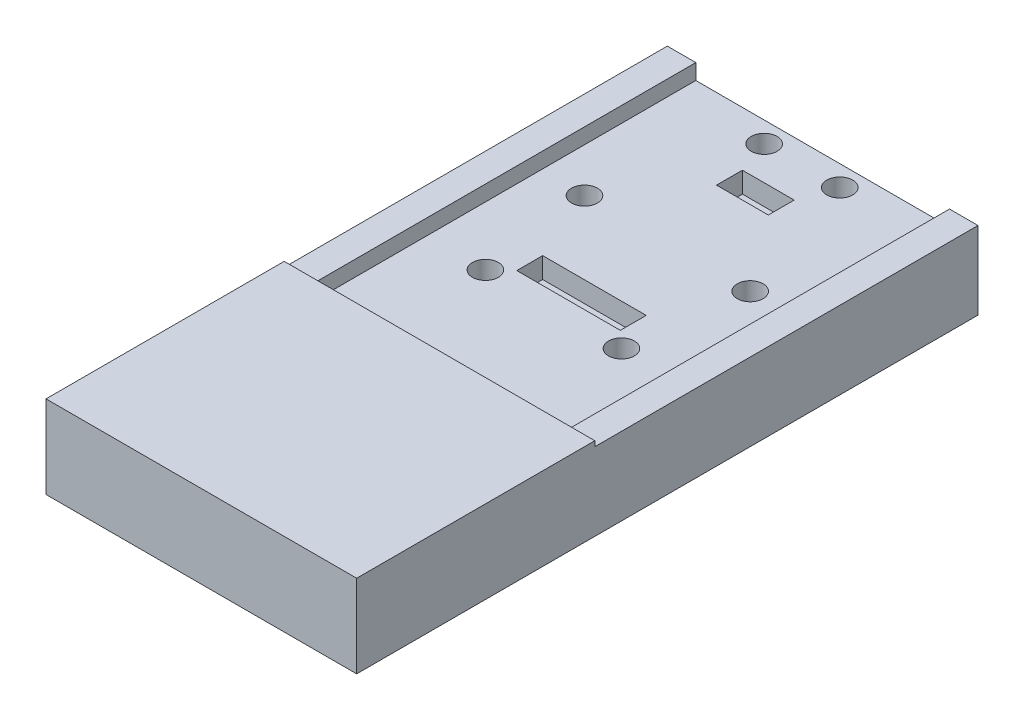
ISO-10303-21;
HEADER;
FILE_DESCRIPTION(('STEP AP214'),'2;1');
FILE_NAME('part.step','',(''),(''),'','','');
FILE_SCHEMA(('AUTOMOTIVE_DESIGN { 1 0 10303 214 1 1 1 1 }'));
ENDSEC;
DATA;
#1=APPLICATION_CONTEXT('core data for automotive mechanical design processes');
#2=APPLICATION_PROTOCOL_DEFINITION('international standard','automotive_design',2000,#1);
#3=PRODUCT_CONTEXT('',#1,'mechanical');
#4=PRODUCT('Part','Part','',(#3));
#5=PRODUCT_RELATED_PRODUCT_CATEGORY('part','',(#4));
#6=PRODUCT_DEFINITION_FORMATION('','',#4);
#7=PRODUCT_DEFINITION_CONTEXT('part definition',#1,'design');
#8=PRODUCT_DEFINITION('design','',#6,#7);
#9=PRODUCT_DEFINITION_SHAPE('','',#8);
#10=(LENGTH_UNIT() NAMED_UNIT(*) SI_UNIT(.MILLI.,.METRE.));
#11=(NAMED_UNIT(*) PLANE_ANGLE_UNIT() SI_UNIT($,.RADIAN.));
#12=(NAMED_UNIT(*) SI_UNIT($,.STERADIAN.) SOLID_ANGLE_UNIT());
#13=UNCERTAINTY_MEASURE_WITH_UNIT(LENGTH_MEASURE(1.E-05),#10,'distance_accuracy_value','');
#14=(GEOMETRIC_REPRESENTATION_CONTEXT(3) GLOBAL_UNCERTAINTY_ASSIGNED_CONTEXT((#13)) GLOBAL_UNIT_ASSIGNED_CONTEXT((#10,
#11,#12)) REPRESENTATION_CONTEXT('',''));
#15=CARTESIAN_POINT('',(0.,0.,0.));
#16=DIRECTION('',(0.,0.,1.));
#17=DIRECTION('',(1.,0.,0.));
#18=AXIS2_PLACEMENT_3D('',#15,#16,#17);
#19=CARTESIAN_POINT('',(0.,0.,0.));
#20=DIRECTION('',(0.,1.,0.));
#21=DIRECTION('',(0.,0.,1.));
#22=AXIS2_PLACEMENT_3D('',#19,#20,#21);
#23=PLANE('',#22);
#24=CARTESIAN_POINT('',(8.,0.,-15.));
#25=DIRECTION('',(0.,1.,0.));
#26=DIRECTION('',(0.,0.,1.));
#27=AXIS2_PLACEMENT_3D('',#24,#25,#26);
#28=CIRCLE('',#27,1.25);
#29=CARTESIAN_POINT('',(8.,0.,-13.75));
#30=VERTEX_POINT('',#29);
#31=EDGE_CURVE('E324',#30,#30,#28,.T.);
#32=ORIENTED_EDGE('',*,*,#31,.F.);
#33=EDGE_LOOP('',(#32));
#34=FACE_BOUND('',#33,.T.);
#35=CARTESIAN_POINT('',(-7.99999999999999,0.,-15.));
#36=DIRECTION('',(0.,1.,0.));
#37=DIRECTION('',(0.,0.,1.));
#38=AXIS2_PLACEMENT_3D('',#35,#36,#37);
#39=CIRCLE('',#38,1.25);
#40=CARTESIAN_POINT('',(-7.99999999999999,0.,-13.75));
#41=VERTEX_POINT('',#40);
#42=EDGE_CURVE('E327',#41,#41,#39,.T.);
#43=ORIENTED_EDGE('',*,*,#42,.F.);
#44=EDGE_LOOP('',(#43));
#45=FACE_BOUND('',#44,.T.);
#46=CARTESIAN_POINT('',(-3.65,0.,-28.));
#47=DIRECTION('',(0.,1.,0.));
#48=DIRECTION('',(0.,0.,1.));
#49=AXIS2_PLACEMENT_3D('',#46,#47,#48);
#50=CIRCLE('',#49,1.25);
#51=CARTESIAN_POINT('',(-3.65,0.,-26.75));
#52=VERTEX_POINT('',#51);
#53=EDGE_CURVE('E281',#52,#52,#50,.T.);
#54=ORIENTED_EDGE('',*,*,#53,.F.);
#55=EDGE_LOOP('',(#54));
#56=FACE_BOUND('',#55,.T.);
#57=CARTESIAN_POINT('',(3.65,0.,-28.));
#58=DIRECTION('',(0.,1.,0.));
#59=DIRECTION('',(0.,0.,1.));
#60=AXIS2_PLACEMENT_3D('',#57,#58,#59);
#61=CIRCLE('',#60,1.25);
#62=CARTESIAN_POINT('',(3.65,0.,-26.75));
#63=VERTEX_POINT('',#62);
#64=EDGE_CURVE('E271',#63,#63,#61,.T.);
#65=ORIENTED_EDGE('',*,*,#64,.F.);
#66=EDGE_LOOP('',(#65));
#67=FACE_BOUND('',#66,.T.);
#68=DIRECTION('',(0.,0.,1.));
#69=VECTOR('',#68,1.);
#70=CARTESIAN_POINT('',(-2.5,0.,-24.75));
#71=LINE('',#70,#69);
#72=CARTESIAN_POINT('',(-2.5,0.,-24.75));
#73=VERTEX_POINT('',#72);
#74=CARTESIAN_POINT('',(-2.5,0.,-22.25));
#75=VERTEX_POINT('',#74);
#76=EDGE_CURVE('E243',#73,#75,#71,.T.);
#77=ORIENTED_EDGE('',*,*,#76,.F.);
#78=DIRECTION('',(-1.,0.,0.));
#79=VECTOR('',#78,1.);
#80=CARTESIAN_POINT('',(-2.5,0.,-24.75));
#81=LINE('',#80,#79);
#82=CARTESIAN_POINT('',(2.5,0.,-24.75));
#83=VERTEX_POINT('',#82);
#84=EDGE_CURVE('E250',#83,#73,#81,.T.);
#85=ORIENTED_EDGE('',*,*,#84,.F.);
#86=DIRECTION('',(0.,0.,-1.));
#87=VECTOR('',#86,1.);
#88=CARTESIAN_POINT('',(2.5,0.,-24.75));
#89=LINE('',#88,#87);
#90=CARTESIAN_POINT('',(2.5,0.,-22.25));
#91=VERTEX_POINT('',#90);
#92=EDGE_CURVE('E264',#91,#83,#89,.T.);
#93=ORIENTED_EDGE('',*,*,#92,.F.);
#94=DIRECTION('',(1.,0.,0.));
#95=VECTOR('',#94,1.);
#96=CARTESIAN_POINT('',(-2.5,0.,-22.25));
#97=LINE('',#96,#95);
#98=EDGE_CURVE('E261',#75,#91,#97,.T.);
#99=ORIENTED_EDGE('',*,*,#98,.F.);
#100=EDGE_LOOP('',(#77,#85,#93,#99));
#101=FACE_BOUND('',#100,.T.);
#102=CARTESIAN_POINT('',(-6.57,0.,-4.));
#103=DIRECTION('',(0.,1.,0.));
#104=DIRECTION('',(0.,0.,1.));
#105=AXIS2_PLACEMENT_3D('',#102,#103,#104);
#106=CIRCLE('',#105,1.25);
#107=CARTESIAN_POINT('',(-6.57,0.,-2.75));
#108=VERTEX_POINT('',#107);
#109=EDGE_CURVE('E237',#108,#108,#106,.T.);
#110=ORIENTED_EDGE('',*,*,#109,.F.);
#111=EDGE_LOOP('',(#110));
#112=FACE_BOUND('',#111,.T.);
#113=CARTESIAN_POINT('',(6.57,0.,-4.));
#114=DIRECTION('',(0.,1.,0.));
#115=DIRECTION('',(0.,0.,1.));
#116=AXIS2_PLACEMENT_3D('',#113,#114,#115);
#117=CIRCLE('',#116,1.25);
#118=CARTESIAN_POINT('',(6.57,0.,-2.75));
#119=VERTEX_POINT('',#118);
#120=EDGE_CURVE('E227',#119,#119,#117,.T.);
#121=ORIENTED_EDGE('',*,*,#120,.F.);
#122=EDGE_LOOP('',(#121));
#123=FACE_BOUND('',#122,.T.);
#124=DIRECTION('',(0.,0.,1.));
#125=VECTOR('',#124,1.);
#126=CARTESIAN_POINT('',(-5.,0.,-7.95999999999999));
#127=LINE('',#126,#125);
#128=CARTESIAN_POINT('',(-5.,0.,-7.95999999999999));
#129=VERTEX_POINT('',#128);
#130=CARTESIAN_POINT('',(-5.,0.,-5.46));
#131=VERTEX_POINT('',#130);
#132=EDGE_CURVE('E201',#129,#131,#127,.T.);
#133=ORIENTED_EDGE('',*,*,#132,.F.);
#134=DIRECTION('',(-1.,0.,0.));
#135=VECTOR('',#134,1.);
#136=CARTESIAN_POINT('',(-5.,0.,-7.95999999999999));
#137=LINE('',#136,#135);
#138=CARTESIAN_POINT('',(5.,0.,-7.96));
#139=VERTEX_POINT('',#138);
#140=EDGE_CURVE('E206',#139,#129,#137,.T.);
#141=ORIENTED_EDGE('',*,*,#140,.F.);
#142=DIRECTION('',(0.,0.,-1.));
#143=VECTOR('',#142,1.);
#144=CARTESIAN_POINT('',(5.,0.,-7.96));
#145=LINE('',#144,#143);
#146=CARTESIAN_POINT('',(5.,0.,-5.46));
#147=VERTEX_POINT('',#146);
#148=EDGE_CURVE('E220',#147,#139,#145,.T.);
#149=ORIENTED_EDGE('',*,*,#148,.F.);
#150=DIRECTION('',(1.,0.,0.));
#151=VECTOR('',#150,1.);
#152=CARTESIAN_POINT('',(-5.,0.,-5.46));
#153=LINE('',#152,#151);
#154=EDGE_CURVE('E217',#131,#147,#153,.T.);
#155=ORIENTED_EDGE('',*,*,#154,.F.);
#156=EDGE_LOOP('',(#133,#141,#149,#155));
#157=FACE_BOUND('',#156,.T.);
#158=DIRECTION('',(0.,0.,-1.));
#159=VECTOR('',#158,1.);
#160=CARTESIAN_POINT('',(-12.25,0.,-30.));
#161=LINE('',#160,#159);
#162=CARTESIAN_POINT('',(-12.25,0.,7.));
#163=VERTEX_POINT('',#162);
#164=CARTESIAN_POINT('',(-12.25,0.,-30.));
#165=VERTEX_POINT('',#164);
#166=EDGE_CURVE('E37',#163,#165,#161,.T.);
#167=ORIENTED_EDGE('',*,*,#166,.F.);
#168=DIRECTION('',(-1.,0.,0.));
#169=VECTOR('',#168,1.);
#170=CARTESIAN_POINT('',(-15.,0.,7.));
#171=LINE('',#170,#169);
#172=CARTESIAN_POINT('',(12.25,0.,7.));
#173=VERTEX_POINT('',#172);
#174=EDGE_CURVE('E184',#173,#163,#171,.T.);
#175=ORIENTED_EDGE('',*,*,#174,.F.);
#176=DIRECTION('',(0.,0.,1.));
#177=VECTOR('',#176,1.);
#178=CARTESIAN_POINT('',(12.25,0.,-30.));
#179=LINE('',#178,#177);
#180=CARTESIAN_POINT('',(12.25,0.,-30.));
#181=VERTEX_POINT('',#180);
#182=EDGE_CURVE('E287',#181,#173,#179,.T.);
#183=ORIENTED_EDGE('',*,*,#182,.F.);
#184=DIRECTION('',(-1.,0.,0.));
#185=VECTOR('',#184,1.);
#186=CARTESIAN_POINT('',(-15.,0.,-30.));
#187=LINE('',#186,#185);
#188=EDGE_CURVE('E330',#181,#165,#187,.T.);
#189=ORIENTED_EDGE('',*,*,#188,.T.);
#190=EDGE_LOOP('',(#167,#175,#183,#189));
#191=FACE_BOUND('',#190,.T.);
#192=ADVANCED_FACE('F33',(#34,#45,#56,#67,#101,#112,#123,#157,#191),#23,.T.);
#193=CARTESIAN_POINT('',(-12.25,1.5,-30.));
#194=DIRECTION('',(-1.,0.,0.));
#195=DIRECTION('',(0.,0.,1.));
#196=AXIS2_PLACEMENT_3D('',#193,#194,#195);
#197=PLANE('',#196);
#198=DIRECTION('',(0.,1.,0.));
#199=VECTOR('',#198,1.);
#200=CARTESIAN_POINT('',(-12.25,1.5,7.));
#201=LINE('',#200,#199);
#202=CARTESIAN_POINT('',(-12.25,1.5,7.));
#203=VERTEX_POINT('',#202);
#204=EDGE_CURVE('E50',#163,#203,#201,.T.);
#205=ORIENTED_EDGE('',*,*,#204,.F.);
#206=ORIENTED_EDGE('',*,*,#166,.T.);
#207=DIRECTION('',(0.,-1.,0.));
#208=VECTOR('',#207,1.);
#209=CARTESIAN_POINT('',(-12.25,1.5,-30.));
#210=LINE('',#209,#208);
#211=CARTESIAN_POINT('',(-12.25,1.5,-30.));
#212=VERTEX_POINT('',#211);
#213=EDGE_CURVE('E307',#212,#165,#210,.T.);
#214=ORIENTED_EDGE('',*,*,#213,.F.);
#215=DIRECTION('',(0.,0.,-1.));
#216=VECTOR('',#215,1.);
#217=CARTESIAN_POINT('',(-12.25,1.5,-30.));
#218=LINE('',#217,#216);
#219=EDGE_CURVE('E303',#203,#212,#218,.T.);
#220=ORIENTED_EDGE('',*,*,#219,.F.);
#221=EDGE_LOOP('',(#205,#206,#214,#220));
#222=FACE_BOUND('',#221,.T.);
#223=ADVANCED_FACE('F374',(#222),#197,.F.);
#224=CARTESIAN_POINT('',(0.,1.5,0.));
#225=DIRECTION('',(0.,1.,0.));
#226=DIRECTION('',(0.,0.,1.));
#227=AXIS2_PLACEMENT_3D('',#224,#225,#226);
#228=PLANE('',#227);
#229=DIRECTION('',(0.,0.,1.));
#230=VECTOR('',#229,1.);
#231=CARTESIAN_POINT('',(-15.,1.5,-30.));
#232=LINE('',#231,#230);
#233=CARTESIAN_POINT('',(-15.,1.5,-30.));
#234=VERTEX_POINT('',#233);
#235=CARTESIAN_POINT('',(-15.,1.5,7.));
#236=VERTEX_POINT('',#235);
#237=EDGE_CURVE('E301',#234,#236,#232,.T.);
#238=ORIENTED_EDGE('',*,*,#237,.T.);
#239=DIRECTION('',(1.,0.,0.));
#240=VECTOR('',#239,1.);
#241=CARTESIAN_POINT('',(0.,1.5,7.));
#242=LINE('',#241,#240);
#243=EDGE_CURVE('E58',#236,#203,#242,.T.);
#244=ORIENTED_EDGE('',*,*,#243,.T.);
#245=ORIENTED_EDGE('',*,*,#219,.T.);
#246=DIRECTION('',(-1.,0.,0.));
#247=VECTOR('',#246,1.);
#248=CARTESIAN_POINT('',(-15.,1.5,-30.));
#249=LINE('',#248,#247);
#250=EDGE_CURVE('E305',#212,#234,#249,.T.);
#251=ORIENTED_EDGE('',*,*,#250,.T.);
#252=EDGE_LOOP('',(#238,#244,#245,#251));
#253=FACE_BOUND('',#252,.T.);
#254=ADVANCED_FACE('F364',(#253),#228,.T.);
#255=CARTESIAN_POINT('',(12.25,1.5,-30.));
#256=DIRECTION('',(1.,0.,0.));
#257=DIRECTION('',(0.,0.,-1.));
#258=AXIS2_PLACEMENT_3D('',#255,#256,#257);
#259=PLANE('',#258);
#260=DIRECTION('',(0.,-1.,0.));
#261=VECTOR('',#260,1.);
#262=CARTESIAN_POINT('',(12.25,1.5,7.));
#263=LINE('',#262,#261);
#264=CARTESIAN_POINT('',(12.25,1.5,7.));
#265=VERTEX_POINT('',#264);
#266=EDGE_CURVE('E196',#265,#173,#263,.T.);
#267=ORIENTED_EDGE('',*,*,#266,.F.);
#268=DIRECTION('',(0.,0.,1.));
#269=VECTOR('',#268,1.);
#270=CARTESIAN_POINT('',(12.25,1.5,-30.));
#271=LINE('',#270,#269);
#272=CARTESIAN_POINT('',(12.25,1.5,-30.));
#273=VERTEX_POINT('',#272);
#274=EDGE_CURVE('E294',#273,#265,#271,.T.);
#275=ORIENTED_EDGE('',*,*,#274,.F.);
#276=DIRECTION('',(0.,-1.,0.));
#277=VECTOR('',#276,1.);
#278=CARTESIAN_POINT('',(12.25,1.5,-30.));
#279=LINE('',#278,#277);
#280=EDGE_CURVE('E296',#273,#181,#279,.T.);
#281=ORIENTED_EDGE('',*,*,#280,.T.);
#282=ORIENTED_EDGE('',*,*,#182,.T.);
#283=EDGE_LOOP('',(#267,#275,#281,#282));
#284=FACE_BOUND('',#283,.T.);
#285=ADVANCED_FACE('F371',(#284),#259,.F.);
#286=CARTESIAN_POINT('',(0.,1.5,0.));
#287=DIRECTION('',(0.,-1.,0.));
#288=DIRECTION('',(0.,0.,-1.));
#289=AXIS2_PLACEMENT_3D('',#286,#287,#288);
#290=PLANE('',#289);
#291=DIRECTION('',(-1.,0.,0.));
#292=VECTOR('',#291,1.);
#293=CARTESIAN_POINT('',(0.,1.5,7.));
#294=LINE('',#293,#292);
#295=CARTESIAN_POINT('',(15.,1.5,7.));
#296=VERTEX_POINT('',#295);
#297=EDGE_CURVE('E11',#296,#265,#294,.T.);
#298=ORIENTED_EDGE('',*,*,#297,.F.);
#299=DIRECTION('',(0.,0.,-1.));
#300=VECTOR('',#299,1.);
#301=CARTESIAN_POINT('',(15.,1.5,-30.));
#302=LINE('',#301,#300);
#303=CARTESIAN_POINT('',(15.,1.5,-30.));
#304=VERTEX_POINT('',#303);
#305=EDGE_CURVE('E290',#296,#304,#302,.T.);
#306=ORIENTED_EDGE('',*,*,#305,.T.);
#307=DIRECTION('',(-1.,0.,0.));
#308=VECTOR('',#307,1.);
#309=CARTESIAN_POINT('',(15.,1.5,-30.));
#310=LINE('',#309,#308);
#311=EDGE_CURVE('E292',#304,#273,#310,.T.);
#312=ORIENTED_EDGE('',*,*,#311,.T.);
#313=ORIENTED_EDGE('',*,*,#274,.T.);
#314=EDGE_LOOP('',(#298,#306,#312,#313));
#315=FACE_BOUND('',#314,.T.);
#316=ADVANCED_FACE('F411',(#315),#290,.F.);
#317=CARTESIAN_POINT('',(-7.99999999999999,-6.,-15.));
#318=DIRECTION('',(0.,1.,0.));
#319=DIRECTION('',(0.,0.,1.));
#320=AXIS2_PLACEMENT_3D('',#317,#318,#319);
#321=CYLINDRICAL_SURFACE('',#320,1.25);
#322=ORIENTED_EDGE('',*,*,#42,.T.);
#323=EDGE_LOOP('',(#322));
#324=FACE_BOUND('',#323,.T.);
#325=CARTESIAN_POINT('',(-7.99999999999999,-4.,-15.));
#326=DIRECTION('',(0.,-1.,0.));
#327=DIRECTION('',(0.,0.,-1.));
#328=AXIS2_PLACEMENT_3D('',#325,#326,#327);
#329=CIRCLE('',#328,1.25);
#330=CARTESIAN_POINT('',(-7.99999999999999,-4.,-16.25));
#331=VERTEX_POINT('',#330);
#332=EDGE_CURVE('E313',#331,#331,#329,.F.);
#333=ORIENTED_EDGE('',*,*,#332,.F.);
#334=EDGE_LOOP('',(#333));
#335=FACE_BOUND('',#334,.T.);
#336=ADVANCED_FACE('F407',(#324,#335),#321,.F.);
#337=CARTESIAN_POINT('',(8.,-6.,-15.));
#338=DIRECTION('',(0.,1.,0.));
#339=DIRECTION('',(0.,0.,1.));
#340=AXIS2_PLACEMENT_3D('',#337,#338,#339);
#341=CYLINDRICAL_SURFACE('',#340,1.25);
#342=ORIENTED_EDGE('',*,*,#31,.T.);
#343=EDGE_LOOP('',(#342));
#344=FACE_BOUND('',#343,.T.);
#345=CARTESIAN_POINT('',(8.,-4.,-15.));
#346=DIRECTION('',(0.,-1.,0.));
#347=DIRECTION('',(0.,0.,-1.));
#348=AXIS2_PLACEMENT_3D('',#345,#346,#347);
#349=CIRCLE('',#348,1.25);
#350=CARTESIAN_POINT('',(8.,-4.,-16.25));
#351=VERTEX_POINT('',#350);
#352=EDGE_CURVE('E320',#351,#351,#349,.F.);
#353=ORIENTED_EDGE('',*,*,#352,.F.);
#354=EDGE_LOOP('',(#353));
#355=FACE_BOUND('',#354,.T.);
#356=ADVANCED_FACE('F404',(#344,#355),#341,.F.);
#357=CARTESIAN_POINT('',(-15.,-6.,-30.));
#358=DIRECTION('',(-1.,0.,0.));
#359=DIRECTION('',(0.,0.,1.));
#360=AXIS2_PLACEMENT_3D('',#357,#358,#359);
#361=PLANE('',#360);
#362=DIRECTION('',(0.,-1.,0.));
#363=VECTOR('',#362,1.);
#364=CARTESIAN_POINT('',(-15.,2.,7.));
#365=LINE('',#364,#363);
#366=CARTESIAN_POINT('',(-15.,2.,7.));
#367=VERTEX_POINT('',#366);
#368=EDGE_CURVE('E190',#367,#236,#365,.T.);
#369=ORIENTED_EDGE('',*,*,#368,.T.);
#370=ORIENTED_EDGE('',*,*,#237,.F.);
#371=DIRECTION('',(0.,1.,0.));
#372=VECTOR('',#371,1.);
#373=CARTESIAN_POINT('',(-15.,-6.,-30.));
#374=LINE('',#373,#372);
#375=CARTESIAN_POINT('',(-15.,-6.,-30.));
#376=VERTEX_POINT('',#375);
#377=EDGE_CURVE('E43',#376,#234,#374,.T.);
#378=ORIENTED_EDGE('',*,*,#377,.F.);
#379=DIRECTION('',(0.,0.,1.));
#380=VECTOR('',#379,1.);
#381=CARTESIAN_POINT('',(-15.,-6.,-30.));
#382=LINE('',#381,#380);
#383=CARTESIAN_POINT('',(-15.,-6.,30.));
#384=VERTEX_POINT('',#383);
#385=EDGE_CURVE('E166',#376,#384,#382,.T.);
#386=ORIENTED_EDGE('',*,*,#385,.T.);
#387=DIRECTION('',(0.,1.,0.));
#388=VECTOR('',#387,1.);
#389=CARTESIAN_POINT('',(-15.,-6.,30.));
#390=LINE('',#389,#388);
#391=CARTESIAN_POINT('',(-15.,2.,30.));
#392=VERTEX_POINT('',#391);
#393=EDGE_CURVE('E160',#384,#392,#390,.T.);
#394=ORIENTED_EDGE('',*,*,#393,.T.);
#395=DIRECTION('',(0.,0.,1.));
#396=VECTOR('',#395,1.);
#397=CARTESIAN_POINT('',(-15.,2.,7.));
#398=LINE('',#397,#396);
#399=EDGE_CURVE('E164',#367,#392,#398,.T.);
#400=ORIENTED_EDGE('',*,*,#399,.F.);
#401=EDGE_LOOP('',(#369,#370,#378,#386,#394,#400));
#402=FACE_BOUND('',#401,.T.);
#403=ADVANCED_FACE('F35',(#402),#361,.T.);
#404=CARTESIAN_POINT('',(-15.,-6.,-30.));
#405=DIRECTION('',(0.,0.,-1.));
#406=DIRECTION('',(-1.,0.,0.));
#407=AXIS2_PLACEMENT_3D('',#404,#405,#406);
#408=PLANE('',#407);
#409=ORIENTED_EDGE('',*,*,#188,.F.);
#410=ORIENTED_EDGE('',*,*,#280,.F.);
#411=ORIENTED_EDGE('',*,*,#311,.F.);
#412=DIRECTION('',(0.,1.,0.));
#413=VECTOR('',#412,1.);
#414=CARTESIAN_POINT('',(15.,-6.,-30.));
#415=LINE('',#414,#413);
#416=CARTESIAN_POINT('',(15.,-6.,-30.));
#417=VERTEX_POINT('',#416);
#418=EDGE_CURVE('E353',#417,#304,#415,.T.);
#419=ORIENTED_EDGE('',*,*,#418,.F.);
#420=DIRECTION('',(-1.,0.,0.));
#421=VECTOR('',#420,1.);
#422=CARTESIAN_POINT('',(-15.,-6.,-30.));
#423=LINE('',#422,#421);
#424=EDGE_CURVE('E171',#417,#376,#423,.T.);
#425=ORIENTED_EDGE('',*,*,#424,.T.);
#426=ORIENTED_EDGE('',*,*,#377,.T.);
#427=ORIENTED_EDGE('',*,*,#250,.F.);
#428=ORIENTED_EDGE('',*,*,#213,.T.);
#429=EDGE_LOOP('',(#409,#410,#411,#419,#425,#426,#427,#428));
#430=FACE_BOUND('',#429,.T.);
#431=ADVANCED_FACE('F361',(#430),#408,.T.);
#432=CARTESIAN_POINT('',(15.,-6.,-30.));
#433=DIRECTION('',(1.,0.,0.));
#434=DIRECTION('',(0.,0.,-1.));
#435=AXIS2_PLACEMENT_3D('',#432,#433,#434);
#436=PLANE('',#435);
#437=ORIENTED_EDGE('',*,*,#305,.F.);
#438=DIRECTION('',(0.,-1.,0.));
#439=VECTOR('',#438,1.);
#440=CARTESIAN_POINT('',(15.,2.,7.));
#441=LINE('',#440,#439);
#442=CARTESIAN_POINT('',(15.,2.,7.));
#443=VERTEX_POINT('',#442);
#444=EDGE_CURVE('E193',#443,#296,#441,.T.);
#445=ORIENTED_EDGE('',*,*,#444,.F.);
#446=DIRECTION('',(0.,0.,-1.));
#447=VECTOR('',#446,1.);
#448=CARTESIAN_POINT('',(15.,2.,7.));
#449=LINE('',#448,#447);
#450=CARTESIAN_POINT('',(15.,2.,30.));
#451=VERTEX_POINT('',#450);
#452=EDGE_CURVE('E178',#451,#443,#449,.T.);
#453=ORIENTED_EDGE('',*,*,#452,.F.);
#454=DIRECTION('',(0.,1.,0.));
#455=VECTOR('',#454,1.);
#456=CARTESIAN_POINT('',(15.,-6.,30.));
#457=LINE('',#456,#455);
#458=CARTESIAN_POINT('',(15.,-6.,30.));
#459=VERTEX_POINT('',#458);
#460=EDGE_CURVE('E170',#459,#451,#457,.T.);
#461=ORIENTED_EDGE('',*,*,#460,.F.);
#462=DIRECTION('',(0.,0.,-1.));
#463=VECTOR('',#462,1.);
#464=CARTESIAN_POINT('',(15.,-6.,-30.));
#465=LINE('',#464,#463);
#466=EDGE_CURVE('E334',#459,#417,#465,.T.);
#467=ORIENTED_EDGE('',*,*,#466,.T.);
#468=ORIENTED_EDGE('',*,*,#418,.T.);
#469=EDGE_LOOP('',(#437,#445,#453,#461,#467,#468));
#470=FACE_BOUND('',#469,.T.);
#471=ADVANCED_FACE('F418',(#470),#436,.T.);
#472=CARTESIAN_POINT('',(-15.,-6.,30.));
#473=DIRECTION('',(0.,0.,1.));
#474=DIRECTION('',(1.,0.,0.));
#475=AXIS2_PLACEMENT_3D('',#472,#473,#474);
#476=PLANE('',#475);
#477=ORIENTED_EDGE('',*,*,#460,.T.);
#478=DIRECTION('',(1.,0.,0.));
#479=VECTOR('',#478,1.);
#480=CARTESIAN_POINT('',(-15.,2.,30.));
#481=LINE('',#480,#479);
#482=EDGE_CURVE('E174',#392,#451,#481,.T.);
#483=ORIENTED_EDGE('',*,*,#482,.F.);
#484=ORIENTED_EDGE('',*,*,#393,.F.);
#485=DIRECTION('',(1.,0.,0.));
#486=VECTOR('',#485,1.);
#487=CARTESIAN_POINT('',(-15.,-6.,30.));
#488=LINE('',#487,#486);
#489=EDGE_CURVE('E332',#384,#459,#488,.T.);
#490=ORIENTED_EDGE('',*,*,#489,.T.);
#491=EDGE_LOOP('',(#477,#483,#484,#490));
#492=FACE_BOUND('',#491,.T.);
#493=ADVANCED_FACE('F175',(#492),#476,.T.);
#494=CARTESIAN_POINT('',(0.,-6.,0.));
#495=DIRECTION('',(0.,1.,0.));
#496=DIRECTION('',(0.,0.,1.));
#497=AXIS2_PLACEMENT_3D('',#494,#495,#496);
#498=PLANE('',#497);
#499=CARTESIAN_POINT('',(-7.99999999999999,-6.,-15.));
#500=DIRECTION('',(0.,-1.,0.));
#501=DIRECTION('',(0.,0.,-1.));
#502=AXIS2_PLACEMENT_3D('',#499,#500,#501);
#503=CIRCLE('',#502,2.25);
#504=CARTESIAN_POINT('',(-7.99999999999999,-6.,-17.25));
#505=VERTEX_POINT('',#504);
#506=EDGE_CURVE('E314',#505,#505,#503,.T.);
#507=ORIENTED_EDGE('',*,*,#506,.F.);
#508=EDGE_LOOP('',(#507));
#509=FACE_BOUND('',#508,.T.);
#510=CARTESIAN_POINT('',(8.,-6.,-15.));
#511=DIRECTION('',(0.,-1.,0.));
#512=DIRECTION('',(0.,0.,-1.));
#513=AXIS2_PLACEMENT_3D('',#510,#511,#512);
#514=CIRCLE('',#513,2.25);
#515=CARTESIAN_POINT('',(8.,-6.,-17.25));
#516=VERTEX_POINT('',#515);
#517=EDGE_CURVE('E321',#516,#516,#514,.T.);
#518=ORIENTED_EDGE('',*,*,#517,.F.);
#519=EDGE_LOOP('',(#518));
#520=FACE_BOUND('',#519,.T.);
#521=ORIENTED_EDGE('',*,*,#385,.F.);
#522=ORIENTED_EDGE('',*,*,#424,.F.);
#523=ORIENTED_EDGE('',*,*,#466,.F.);
#524=ORIENTED_EDGE('',*,*,#489,.F.);
#525=EDGE_LOOP('',(#521,#522,#523,#524));
#526=FACE_BOUND('',#525,.T.);
#527=ADVANCED_FACE('F399',(#509,#520,#526),#498,.F.);
#528=CARTESIAN_POINT('',(8.,-4.,-15.));
#529=DIRECTION('',(0.,-1.,0.));
#530=DIRECTION('',(0.,0.,-1.));
#531=AXIS2_PLACEMENT_3D('',#528,#529,#530);
#532=PLANE('',#531);
#533=CARTESIAN_POINT('',(8.,-4.,-15.));
#534=DIRECTION('',(0.,-1.,0.));
#535=DIRECTION('',(0.,0.,-1.));
#536=AXIS2_PLACEMENT_3D('',#533,#534,#535);
#537=CIRCLE('',#536,2.25);
#538=CARTESIAN_POINT('',(8.,-4.,-17.25));
#539=VERTEX_POINT('',#538);
#540=EDGE_CURVE('E317',#539,#539,#537,.T.);
#541=ORIENTED_EDGE('',*,*,#540,.T.);
#542=EDGE_LOOP('',(#541));
#543=FACE_BOUND('',#542,.T.);
#544=ORIENTED_EDGE('',*,*,#352,.T.);
#545=EDGE_LOOP('',(#544));
#546=FACE_BOUND('',#545,.T.);
#547=ADVANCED_FACE('F396',(#543,#546),#532,.T.);
#548=CARTESIAN_POINT('',(8.,-4.,-15.));
#549=DIRECTION('',(0.,-1.,0.));
#550=DIRECTION('',(0.,0.,-1.));
#551=AXIS2_PLACEMENT_3D('',#548,#549,#550);
#552=CYLINDRICAL_SURFACE('',#551,2.25);
#553=ORIENTED_EDGE('',*,*,#540,.F.);
#554=EDGE_LOOP('',(#553));
#555=FACE_BOUND('',#554,.T.);
#556=ORIENTED_EDGE('',*,*,#517,.T.);
#557=EDGE_LOOP('',(#556));
#558=FACE_BOUND('',#557,.T.);
#559=ADVANCED_FACE('F390',(#555,#558),#552,.F.);
#560=CARTESIAN_POINT('',(-7.99999999999999,-4.,-15.));
#561=DIRECTION('',(0.,-1.,0.));
#562=DIRECTION('',(0.,0.,-1.));
#563=AXIS2_PLACEMENT_3D('',#560,#561,#562);
#564=PLANE('',#563);
#565=CARTESIAN_POINT('',(-7.99999999999999,-4.,-15.));
#566=DIRECTION('',(0.,-1.,0.));
#567=DIRECTION('',(0.,0.,-1.));
#568=AXIS2_PLACEMENT_3D('',#565,#566,#567);
#569=CIRCLE('',#568,2.25);
#570=CARTESIAN_POINT('',(-7.99999999999999,-4.,-17.25));
#571=VERTEX_POINT('',#570);
#572=EDGE_CURVE('E310',#571,#571,#569,.T.);
#573=ORIENTED_EDGE('',*,*,#572,.T.);
#574=EDGE_LOOP('',(#573));
#575=FACE_BOUND('',#574,.T.);
#576=ORIENTED_EDGE('',*,*,#332,.T.);
#577=EDGE_LOOP('',(#576));
#578=FACE_BOUND('',#577,.T.);
#579=ADVANCED_FACE('F386',(#575,#578),#564,.T.);
#580=CARTESIAN_POINT('',(-7.99999999999999,-4.,-15.));
#581=DIRECTION('',(0.,-1.,0.));
#582=DIRECTION('',(0.,0.,-1.));
#583=AXIS2_PLACEMENT_3D('',#580,#581,#582);
#584=CYLINDRICAL_SURFACE('',#583,2.25);
#585=ORIENTED_EDGE('',*,*,#572,.F.);
#586=EDGE_LOOP('',(#585));
#587=FACE_BOUND('',#586,.T.);
#588=ORIENTED_EDGE('',*,*,#506,.T.);
#589=EDGE_LOOP('',(#588));
#590=FACE_BOUND('',#589,.T.);
#591=ADVANCED_FACE('F389',(#587,#590),#584,.F.);
#592=CARTESIAN_POINT('',(-3.65,-2.,-28.));
#593=DIRECTION('',(0.,1.,0.));
#594=DIRECTION('',(0.,0.,1.));
#595=AXIS2_PLACEMENT_3D('',#592,#593,#594);
#596=CYLINDRICAL_SURFACE('',#595,1.25);
#597=CARTESIAN_POINT('',(-3.65,-2.,-28.));
#598=DIRECTION('',(0.,1.,0.));
#599=DIRECTION('',(0.,0.,1.));
#600=AXIS2_PLACEMENT_3D('',#597,#598,#599);
#601=CIRCLE('',#600,1.25);
#602=CARTESIAN_POINT('',(-3.65,-2.,-26.75));
#603=VERTEX_POINT('',#602);
#604=EDGE_CURVE('E284',#603,#603,#601,.T.);
#605=ORIENTED_EDGE('',*,*,#604,.F.);
#606=EDGE_LOOP('',(#605));
#607=FACE_BOUND('',#606,.T.);
#608=ORIENTED_EDGE('',*,*,#53,.T.);
#609=EDGE_LOOP('',(#608));
#610=FACE_BOUND('',#609,.T.);
#611=ADVANCED_FACE('F394',(#607,#610),#596,.F.);
#612=CARTESIAN_POINT('',(-3.65,-2.,-28.));
#613=DIRECTION('',(0.,1.,0.));
#614=DIRECTION('',(0.,0.,1.));
#615=AXIS2_PLACEMENT_3D('',#612,#613,#614);
#616=PLANE('',#615);
#617=ORIENTED_EDGE('',*,*,#604,.T.);
#618=EDGE_LOOP('',(#617));
#619=FACE_BOUND('',#618,.T.);
#620=ADVANCED_FACE('F454',(#619),#616,.T.);
#621=CARTESIAN_POINT('',(3.65,-2.,-28.));
#622=DIRECTION('',(0.,1.,0.));
#623=DIRECTION('',(0.,0.,1.));
#624=AXIS2_PLACEMENT_3D('',#621,#622,#623);
#625=CYLINDRICAL_SURFACE('',#624,1.25);
#626=CARTESIAN_POINT('',(3.65,-2.,-28.));
#627=DIRECTION('',(0.,1.,0.));
#628=DIRECTION('',(0.,0.,1.));
#629=AXIS2_PLACEMENT_3D('',#626,#627,#628);
#630=CIRCLE('',#629,1.25);
#631=CARTESIAN_POINT('',(3.65,-2.,-26.75));
#632=VERTEX_POINT('',#631);
#633=EDGE_CURVE('E278',#632,#632,#630,.T.);
#634=ORIENTED_EDGE('',*,*,#633,.F.);
#635=EDGE_LOOP('',(#634));
#636=FACE_BOUND('',#635,.T.);
#637=ORIENTED_EDGE('',*,*,#64,.T.);
#638=EDGE_LOOP('',(#637));
#639=FACE_BOUND('',#638,.T.);
#640=ADVANCED_FACE('F462',(#636,#639),#625,.F.);
#641=CARTESIAN_POINT('',(3.65,-2.,-28.));
#642=DIRECTION('',(0.,1.,0.));
#643=DIRECTION('',(0.,0.,1.));
#644=AXIS2_PLACEMENT_3D('',#641,#642,#643);
#645=PLANE('',#644);
#646=ORIENTED_EDGE('',*,*,#633,.T.);
#647=EDGE_LOOP('',(#646));
#648=FACE_BOUND('',#647,.T.);
#649=ADVANCED_FACE('F470',(#648),#645,.T.);
#650=CARTESIAN_POINT('',(-2.5,-2.,-24.75));
#651=DIRECTION('',(-1.,0.,0.));
#652=DIRECTION('',(0.,0.,1.));
#653=AXIS2_PLACEMENT_3D('',#650,#651,#652);
#654=PLANE('',#653);
#655=ORIENTED_EDGE('',*,*,#76,.T.);
#656=DIRECTION('',(0.,1.,0.));
#657=VECTOR('',#656,1.);
#658=CARTESIAN_POINT('',(-2.5,-2.,-22.25));
#659=LINE('',#658,#657);
#660=CARTESIAN_POINT('',(-2.5,-2.,-22.25));
#661=VERTEX_POINT('',#660);
#662=EDGE_CURVE('E259',#661,#75,#659,.T.);
#663=ORIENTED_EDGE('',*,*,#662,.F.);
#664=DIRECTION('',(0.,0.,1.));
#665=VECTOR('',#664,1.);
#666=CARTESIAN_POINT('',(-2.5,-2.,-24.75));
#667=LINE('',#666,#665);
#668=CARTESIAN_POINT('',(-2.5,-2.,-24.75));
#669=VERTEX_POINT('',#668);
#670=EDGE_CURVE('E246',#669,#661,#667,.T.);
#671=ORIENTED_EDGE('',*,*,#670,.F.);
#672=DIRECTION('',(0.,1.,0.));
#673=VECTOR('',#672,1.);
#674=CARTESIAN_POINT('',(-2.5,-2.,-24.75));
#675=LINE('',#674,#673);
#676=EDGE_CURVE('E269',#669,#73,#675,.T.);
#677=ORIENTED_EDGE('',*,*,#676,.T.);
#678=EDGE_LOOP('',(#655,#663,#671,#677));
#679=FACE_BOUND('',#678,.T.);
#680=ADVANCED_FACE('F478',(#679),#654,.F.);
#681=CARTESIAN_POINT('',(-2.5,-2.,-24.75));
#682=DIRECTION('',(0.,0.,-1.));
#683=DIRECTION('',(-1.,0.,0.));
#684=AXIS2_PLACEMENT_3D('',#681,#682,#683);
#685=PLANE('',#684);
#686=ORIENTED_EDGE('',*,*,#84,.T.);
#687=ORIENTED_EDGE('',*,*,#676,.F.);
#688=DIRECTION('',(-1.,0.,0.));
#689=VECTOR('',#688,1.);
#690=CARTESIAN_POINT('',(-2.5,-2.,-24.75));
#691=LINE('',#690,#689);
#692=CARTESIAN_POINT('',(2.5,-2.,-24.75));
#693=VERTEX_POINT('',#692);
#694=EDGE_CURVE('E256',#693,#669,#691,.T.);
#695=ORIENTED_EDGE('',*,*,#694,.F.);
#696=DIRECTION('',(0.,1.,0.));
#697=VECTOR('',#696,1.);
#698=CARTESIAN_POINT('',(2.5,-2.,-24.75));
#699=LINE('',#698,#697);
#700=EDGE_CURVE('E272',#693,#83,#699,.T.);
#701=ORIENTED_EDGE('',*,*,#700,.T.);
#702=EDGE_LOOP('',(#686,#687,#695,#701));
#703=FACE_BOUND('',#702,.T.);
#704=ADVANCED_FACE('F486',(#703),#685,.F.);
#705=CARTESIAN_POINT('',(2.5,-2.,-24.75));
#706=DIRECTION('',(1.,0.,0.));
#707=DIRECTION('',(0.,0.,-1.));
#708=AXIS2_PLACEMENT_3D('',#705,#706,#707);
#709=PLANE('',#708);
#710=ORIENTED_EDGE('',*,*,#92,.T.);
#711=ORIENTED_EDGE('',*,*,#700,.F.);
#712=DIRECTION('',(0.,0.,-1.));
#713=VECTOR('',#712,1.);
#714=CARTESIAN_POINT('',(2.5,-2.,-24.75));
#715=LINE('',#714,#713);
#716=CARTESIAN_POINT('',(2.5,-2.,-22.25));
#717=VERTEX_POINT('',#716);
#718=EDGE_CURVE('E253',#717,#693,#715,.T.);
#719=ORIENTED_EDGE('',*,*,#718,.F.);
#720=DIRECTION('',(0.,1.,0.));
#721=VECTOR('',#720,1.);
#722=CARTESIAN_POINT('',(2.5,-2.,-22.25));
#723=LINE('',#722,#721);
#724=EDGE_CURVE('E274',#717,#91,#723,.T.);
#725=ORIENTED_EDGE('',*,*,#724,.T.);
#726=EDGE_LOOP('',(#710,#711,#719,#725));
#727=FACE_BOUND('',#726,.T.);
#728=ADVANCED_FACE('F494',(#727),#709,.F.);
#729=CARTESIAN_POINT('',(-2.5,-2.,-22.25));
#730=DIRECTION('',(0.,0.,1.));
#731=DIRECTION('',(1.,0.,0.));
#732=AXIS2_PLACEMENT_3D('',#729,#730,#731);
#733=PLANE('',#732);
#734=ORIENTED_EDGE('',*,*,#98,.T.);
#735=ORIENTED_EDGE('',*,*,#724,.F.);
#736=DIRECTION('',(1.,0.,0.));
#737=VECTOR('',#736,1.);
#738=CARTESIAN_POINT('',(-2.5,-2.,-22.25));
#739=LINE('',#738,#737);
#740=EDGE_CURVE('E249',#661,#717,#739,.T.);
#741=ORIENTED_EDGE('',*,*,#740,.F.);
#742=ORIENTED_EDGE('',*,*,#662,.T.);
#743=EDGE_LOOP('',(#734,#735,#741,#742));
#744=FACE_BOUND('',#743,.T.);
#745=ADVANCED_FACE('F502',(#744),#733,.F.);
#746=CARTESIAN_POINT('',(0.,-2.,0.));
#747=DIRECTION('',(0.,1.,0.));
#748=DIRECTION('',(0.,0.,1.));
#749=AXIS2_PLACEMENT_3D('',#746,#747,#748);
#750=PLANE('',#749);
#751=ORIENTED_EDGE('',*,*,#670,.T.);
#752=ORIENTED_EDGE('',*,*,#740,.T.);
#753=ORIENTED_EDGE('',*,*,#718,.T.);
#754=ORIENTED_EDGE('',*,*,#694,.T.);
#755=EDGE_LOOP('',(#751,#752,#753,#754));
#756=FACE_BOUND('',#755,.T.);
#757=ADVANCED_FACE('F510',(#756),#750,.T.);
#758=CARTESIAN_POINT('',(-6.57,-2.,-4.));
#759=DIRECTION('',(0.,1.,0.));
#760=DIRECTION('',(0.,0.,1.));
#761=AXIS2_PLACEMENT_3D('',#758,#759,#760);
#762=CYLINDRICAL_SURFACE('',#761,1.25);
#763=CARTESIAN_POINT('',(-6.57,-2.,-4.));
#764=DIRECTION('',(0.,1.,0.));
#765=DIRECTION('',(0.,0.,1.));
#766=AXIS2_PLACEMENT_3D('',#763,#764,#765);
#767=CIRCLE('',#766,1.25);
#768=CARTESIAN_POINT('',(-6.57,-2.,-2.75));
#769=VERTEX_POINT('',#768);
#770=EDGE_CURVE('E240',#769,#769,#767,.T.);
#771=ORIENTED_EDGE('',*,*,#770,.F.);
#772=EDGE_LOOP('',(#771));
#773=FACE_BOUND('',#772,.T.);
#774=ORIENTED_EDGE('',*,*,#109,.T.);
#775=EDGE_LOOP('',(#774));
#776=FACE_BOUND('',#775,.T.);
#777=ADVANCED_FACE('F518',(#773,#776),#762,.F.);
#778=CARTESIAN_POINT('',(-6.57,-2.,-4.));
#779=DIRECTION('',(0.,1.,0.));
#780=DIRECTION('',(0.,0.,1.));
#781=AXIS2_PLACEMENT_3D('',#778,#779,#780);
#782=PLANE('',#781);
#783=ORIENTED_EDGE('',*,*,#770,.T.);
#784=EDGE_LOOP('',(#783));
#785=FACE_BOUND('',#784,.T.);
#786=ADVANCED_FACE('F526',(#785),#782,.T.);
#787=CARTESIAN_POINT('',(6.57,-2.,-4.));
#788=DIRECTION('',(0.,1.,0.));
#789=DIRECTION('',(0.,0.,1.));
#790=AXIS2_PLACEMENT_3D('',#787,#788,#789);
#791=CYLINDRICAL_SURFACE('',#790,1.25);
#792=CARTESIAN_POINT('',(6.57,-2.,-4.));
#793=DIRECTION('',(0.,1.,0.));
#794=DIRECTION('',(0.,0.,1.));
#795=AXIS2_PLACEMENT_3D('',#792,#793,#794);
#796=CIRCLE('',#795,1.25);
#797=CARTESIAN_POINT('',(6.57,-2.,-2.75));
#798=VERTEX_POINT('',#797);
#799=EDGE_CURVE('E234',#798,#798,#796,.T.);
#800=ORIENTED_EDGE('',*,*,#799,.F.);
#801=EDGE_LOOP('',(#800));
#802=FACE_BOUND('',#801,.T.);
#803=ORIENTED_EDGE('',*,*,#120,.T.);
#804=EDGE_LOOP('',(#803));
#805=FACE_BOUND('',#804,.T.);
#806=ADVANCED_FACE('F534',(#802,#805),#791,.F.);
#807=CARTESIAN_POINT('',(6.57,-2.,-4.));
#808=DIRECTION('',(0.,1.,0.));
#809=DIRECTION('',(0.,0.,1.));
#810=AXIS2_PLACEMENT_3D('',#807,#808,#809);
#811=PLANE('',#810);
#812=ORIENTED_EDGE('',*,*,#799,.T.);
#813=EDGE_LOOP('',(#812));
#814=FACE_BOUND('',#813,.T.);
#815=ADVANCED_FACE('F542',(#814),#811,.T.);
#816=CARTESIAN_POINT('',(-5.,-2.,-7.95999999999999));
#817=DIRECTION('',(-1.,0.,0.));
#818=DIRECTION('',(0.,0.,1.));
#819=AXIS2_PLACEMENT_3D('',#816,#817,#818);
#820=PLANE('',#819);
#821=ORIENTED_EDGE('',*,*,#132,.T.);
#822=DIRECTION('',(0.,1.,0.));
#823=VECTOR('',#822,1.);
#824=CARTESIAN_POINT('',(-5.,-2.,-5.46));
#825=LINE('',#824,#823);
#826=CARTESIAN_POINT('',(-5.,-2.,-5.46));
#827=VERTEX_POINT('',#826);
#828=EDGE_CURVE('E215',#827,#131,#825,.T.);
#829=ORIENTED_EDGE('',*,*,#828,.F.);
#830=DIRECTION('',(0.,0.,1.));
#831=VECTOR('',#830,1.);
#832=CARTESIAN_POINT('',(-5.,-2.,-7.95999999999999));
#833=LINE('',#832,#831);
#834=CARTESIAN_POINT('',(-5.,-2.,-7.95999999999999));
#835=VERTEX_POINT('',#834);
#836=EDGE_CURVE('E202',#835,#827,#833,.T.);
#837=ORIENTED_EDGE('',*,*,#836,.F.);
#838=DIRECTION('',(0.,1.,0.));
#839=VECTOR('',#838,1.);
#840=CARTESIAN_POINT('',(-5.,-2.,-7.95999999999999));
#841=LINE('',#840,#839);
#842=EDGE_CURVE('E225',#835,#129,#841,.T.);
#843=ORIENTED_EDGE('',*,*,#842,.T.);
#844=EDGE_LOOP('',(#821,#829,#837,#843));
#845=FACE_BOUND('',#844,.T.);
#846=ADVANCED_FACE('F550',(#845),#820,.F.);
#847=CARTESIAN_POINT('',(-5.,-2.,-7.95999999999999));
#848=DIRECTION('',(0.,0.,-1.));
#849=DIRECTION('',(-1.,0.,0.));
#850=AXIS2_PLACEMENT_3D('',#847,#848,#849);
#851=PLANE('',#850);
#852=ORIENTED_EDGE('',*,*,#140,.T.);
#853=ORIENTED_EDGE('',*,*,#842,.F.);
#854=DIRECTION('',(-1.,0.,0.));
#855=VECTOR('',#854,1.);
#856=CARTESIAN_POINT('',(-5.,-2.,-7.95999999999999));
#857=LINE('',#856,#855);
#858=CARTESIAN_POINT('',(5.,-2.,-7.96));
#859=VERTEX_POINT('',#858);
#860=EDGE_CURVE('E212',#859,#835,#857,.T.);
#861=ORIENTED_EDGE('',*,*,#860,.F.);
#862=DIRECTION('',(0.,1.,0.));
#863=VECTOR('',#862,1.);
#864=CARTESIAN_POINT('',(5.,-2.,-7.96));
#865=LINE('',#864,#863);
#866=EDGE_CURVE('E228',#859,#139,#865,.T.);
#867=ORIENTED_EDGE('',*,*,#866,.T.);
#868=EDGE_LOOP('',(#852,#853,#861,#867));
#869=FACE_BOUND('',#868,.T.);
#870=ADVANCED_FACE('F558',(#869),#851,.F.);
#871=CARTESIAN_POINT('',(5.,-2.,-7.96));
#872=DIRECTION('',(1.,0.,0.));
#873=DIRECTION('',(0.,0.,-1.));
#874=AXIS2_PLACEMENT_3D('',#871,#872,#873);
#875=PLANE('',#874);
#876=ORIENTED_EDGE('',*,*,#148,.T.);
#877=ORIENTED_EDGE('',*,*,#866,.F.);
#878=DIRECTION('',(0.,0.,-1.));
#879=VECTOR('',#878,1.);
#880=CARTESIAN_POINT('',(5.,-2.,-7.96));
#881=LINE('',#880,#879);
#882=CARTESIAN_POINT('',(5.,-2.,-5.46));
#883=VERTEX_POINT('',#882);
#884=EDGE_CURVE('E209',#883,#859,#881,.T.);
#885=ORIENTED_EDGE('',*,*,#884,.F.);
#886=DIRECTION('',(0.,1.,0.));
#887=VECTOR('',#886,1.);
#888=CARTESIAN_POINT('',(5.,-2.,-5.46));
#889=LINE('',#888,#887);
#890=EDGE_CURVE('E230',#883,#147,#889,.T.);
#891=ORIENTED_EDGE('',*,*,#890,.T.);
#892=EDGE_LOOP('',(#876,#877,#885,#891));
#893=FACE_BOUND('',#892,.T.);
#894=ADVANCED_FACE('F566',(#893),#875,.F.);
#895=CARTESIAN_POINT('',(-5.,-2.,-5.46));
#896=DIRECTION('',(0.,0.,1.));
#897=DIRECTION('',(1.,0.,0.));
#898=AXIS2_PLACEMENT_3D('',#895,#896,#897);
#899=PLANE('',#898);
#900=ORIENTED_EDGE('',*,*,#154,.T.);
#901=ORIENTED_EDGE('',*,*,#890,.F.);
#902=DIRECTION('',(1.,0.,0.));
#903=VECTOR('',#902,1.);
#904=CARTESIAN_POINT('',(-5.,-2.,-5.46));
#905=LINE('',#904,#903);
#906=EDGE_CURVE('E205',#827,#883,#905,.T.);
#907=ORIENTED_EDGE('',*,*,#906,.F.);
#908=ORIENTED_EDGE('',*,*,#828,.T.);
#909=EDGE_LOOP('',(#900,#901,#907,#908));
#910=FACE_BOUND('',#909,.T.);
#911=ADVANCED_FACE('F574',(#910),#899,.F.);
#912=CARTESIAN_POINT('',(0.,-2.,0.));
#913=DIRECTION('',(0.,1.,0.));
#914=DIRECTION('',(0.,0.,1.));
#915=AXIS2_PLACEMENT_3D('',#912,#913,#914);
#916=PLANE('',#915);
#917=ORIENTED_EDGE('',*,*,#836,.T.);
#918=ORIENTED_EDGE('',*,*,#906,.T.);
#919=ORIENTED_EDGE('',*,*,#884,.T.);
#920=ORIENTED_EDGE('',*,*,#860,.T.);
#921=EDGE_LOOP('',(#917,#918,#919,#920));
#922=FACE_BOUND('',#921,.T.);
#923=ADVANCED_FACE('F582',(#922),#916,.T.);
#924=CARTESIAN_POINT('',(-15.,2.,7.));
#925=DIRECTION('',(0.,0.,1.));
#926=DIRECTION('',(1.,0.,0.));
#927=AXIS2_PLACEMENT_3D('',#924,#925,#926);
#928=PLANE('',#927);
#929=ORIENTED_EDGE('',*,*,#174,.T.);
#930=ORIENTED_EDGE('',*,*,#204,.T.);
#931=ORIENTED_EDGE('',*,*,#243,.F.);
#932=ORIENTED_EDGE('',*,*,#368,.F.);
#933=DIRECTION('',(-1.,0.,0.));
#934=VECTOR('',#933,1.);
#935=CARTESIAN_POINT('',(-15.,2.,7.));
#936=LINE('',#935,#934);
#937=EDGE_CURVE('E182',#443,#367,#936,.T.);
#938=ORIENTED_EDGE('',*,*,#937,.F.);
#939=ORIENTED_EDGE('',*,*,#444,.T.);
#940=ORIENTED_EDGE('',*,*,#297,.T.);
#941=ORIENTED_EDGE('',*,*,#266,.T.);
#942=EDGE_LOOP('',(#929,#930,#931,#932,#938,#939,#940,#941));
#943=FACE_BOUND('',#942,.T.);
#944=ADVANCED_FACE('F367',(#943),#928,.F.);
#945=CARTESIAN_POINT('',(0.,2.,0.));
#946=DIRECTION('',(0.,1.,0.));
#947=DIRECTION('',(0.,0.,1.));
#948=AXIS2_PLACEMENT_3D('',#945,#946,#947);
#949=PLANE('',#948);
#950=ORIENTED_EDGE('',*,*,#399,.T.);
#951=ORIENTED_EDGE('',*,*,#482,.T.);
#952=ORIENTED_EDGE('',*,*,#452,.T.);
#953=ORIENTED_EDGE('',*,*,#937,.T.);
#954=EDGE_LOOP('',(#950,#951,#952,#953));
#955=FACE_BOUND('',#954,.T.);
#956=ADVANCED_FACE('F180',(#955),#949,.T.);
#957=CLOSED_SHELL('',(#192,#223,#254,#285,#316,#336,#356,#403,#431,#471,#493,#527,#547,#559,
#579,#591,#611,#620,#640,#649,#680,#704,#728,#745,#757,#777,#786,#806,#815,#846,#870,#894,#911,
#923,#944,#956));
#958=MANIFOLD_SOLID_BREP('B2',#957);
#959=ADVANCED_BREP_SHAPE_REPRESENTATION('',(#18,#958),#14);
#960=SHAPE_DEFINITION_REPRESENTATION(#9,#959);
ENDSEC;
END-ISO-10303-21;
